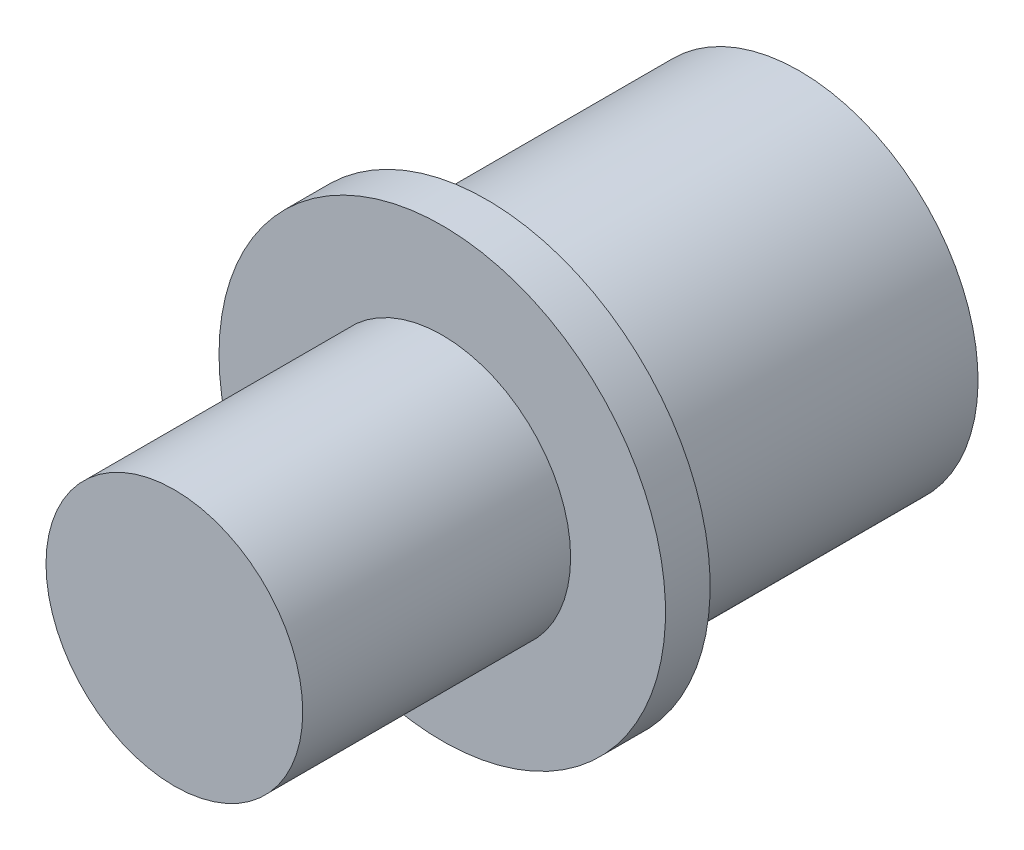
ISO-10303-21;
HEADER;
FILE_DESCRIPTION(('STEP AP214'),'2;1');
FILE_NAME('part.step','',(''),(''),'','','');
FILE_SCHEMA(('AUTOMOTIVE_DESIGN { 1 0 10303 214 1 1 1 1 }'));
ENDSEC;
DATA;
#1=APPLICATION_CONTEXT('core data for automotive mechanical design processes');
#2=APPLICATION_PROTOCOL_DEFINITION('international standard','automotive_design',2000,#1);
#3=PRODUCT_CONTEXT('',#1,'mechanical');
#4=PRODUCT('Part','Part','',(#3));
#5=PRODUCT_RELATED_PRODUCT_CATEGORY('part','',(#4));
#6=PRODUCT_DEFINITION_FORMATION('','',#4);
#7=PRODUCT_DEFINITION_CONTEXT('part definition',#1,'design');
#8=PRODUCT_DEFINITION('design','',#6,#7);
#9=PRODUCT_DEFINITION_SHAPE('','',#8);
#10=(LENGTH_UNIT() NAMED_UNIT(*) SI_UNIT(.MILLI.,.METRE.));
#11=(NAMED_UNIT(*) PLANE_ANGLE_UNIT() SI_UNIT($,.RADIAN.));
#12=(NAMED_UNIT(*) SI_UNIT($,.STERADIAN.) SOLID_ANGLE_UNIT());
#13=UNCERTAINTY_MEASURE_WITH_UNIT(LENGTH_MEASURE(1.E-05),#10,'distance_accuracy_value','');
#14=(GEOMETRIC_REPRESENTATION_CONTEXT(3) GLOBAL_UNCERTAINTY_ASSIGNED_CONTEXT((#13)) GLOBAL_UNIT_ASSIGNED_CONTEXT((#10,
#11,#12)) REPRESENTATION_CONTEXT('',''));
#15=CARTESIAN_POINT('',(0.,0.,0.));
#16=DIRECTION('',(0.,0.,1.));
#17=DIRECTION('',(1.,0.,0.));
#18=AXIS2_PLACEMENT_3D('',#15,#16,#17);
#19=CARTESIAN_POINT('',(0.,0.,-1.));
#20=DIRECTION('',(0.,0.,1.));
#21=DIRECTION('',(1.,0.,0.));
#22=AXIS2_PLACEMENT_3D('',#19,#20,#21);
#23=CYLINDRICAL_SURFACE('',#22,5.);
#24=CARTESIAN_POINT('',(0.,0.,-1.));
#25=DIRECTION('',(0.,0.,-1.));
#26=DIRECTION('',(-1.,0.,0.));
#27=AXIS2_PLACEMENT_3D('',#24,#25,#26);
#28=CIRCLE('',#27,5.);
#29=CARTESIAN_POINT('',(-5.,0.,-1.));
#30=VERTEX_POINT('',#29);
#31=EDGE_CURVE('E51',#30,#30,#28,.T.);
#32=ORIENTED_EDGE('',*,*,#31,.F.);
#33=EDGE_LOOP('',(#32));
#34=FACE_BOUND('',#33,.T.);
#35=CARTESIAN_POINT('',(0.,0.,0.));
#36=DIRECTION('',(0.,0.,-1.));
#37=DIRECTION('',(-1.,0.,0.));
#38=AXIS2_PLACEMENT_3D('',#35,#36,#37);
#39=CIRCLE('',#38,5.);
#40=CARTESIAN_POINT('',(-5.,0.,0.));
#41=VERTEX_POINT('',#40);
#42=EDGE_CURVE('E40',#41,#41,#39,.T.);
#43=ORIENTED_EDGE('',*,*,#42,.T.);
#44=EDGE_LOOP('',(#43));
#45=FACE_BOUND('',#44,.T.);
#46=ADVANCED_FACE('F37',(#34,#45),#23,.T.);
#47=CARTESIAN_POINT('',(0.,0.,-1.));
#48=DIRECTION('',(0.,0.,-1.));
#49=DIRECTION('',(-1.,0.,0.));
#50=AXIS2_PLACEMENT_3D('',#47,#48,#49);
#51=PLANE('',#50);
#52=CARTESIAN_POINT('',(0.,0.,-1.));
#53=DIRECTION('',(0.,0.,-1.));
#54=DIRECTION('',(0.,1.,0.));
#55=AXIS2_PLACEMENT_3D('',#52,#53,#54);
#56=CIRCLE('',#55,4.);
#57=CARTESIAN_POINT('',(0.,4.,-1.));
#58=VERTEX_POINT('',#57);
#59=EDGE_CURVE('E45',#58,#58,#56,.T.);
#60=ORIENTED_EDGE('',*,*,#59,.F.);
#61=EDGE_LOOP('',(#60));
#62=FACE_BOUND('',#61,.T.);
#63=ORIENTED_EDGE('',*,*,#31,.T.);
#64=EDGE_LOOP('',(#63));
#65=FACE_BOUND('',#64,.T.);
#66=ADVANCED_FACE('F79',(#62,#65),#51,.T.);
#67=CARTESIAN_POINT('',(0.,0.,0.));
#68=DIRECTION('',(0.,0.,-1.));
#69=DIRECTION('',(-1.,0.,0.));
#70=AXIS2_PLACEMENT_3D('',#67,#68,#69);
#71=PLANE('',#70);
#72=CARTESIAN_POINT('',(0.,0.,0.));
#73=DIRECTION('',(0.,0.,1.));
#74=DIRECTION('',(1.,0.,0.));
#75=AXIS2_PLACEMENT_3D('',#72,#73,#74);
#76=CIRCLE('',#75,2.875);
#77=CARTESIAN_POINT('',(2.875,0.,0.));
#78=VERTEX_POINT('',#77);
#79=EDGE_CURVE('E10',#78,#78,#76,.T.);
#80=ORIENTED_EDGE('',*,*,#79,.F.);
#81=EDGE_LOOP('',(#80));
#82=FACE_BOUND('',#81,.T.);
#83=ORIENTED_EDGE('',*,*,#42,.F.);
#84=EDGE_LOOP('',(#83));
#85=FACE_BOUND('',#84,.T.);
#86=ADVANCED_FACE('F76',(#82,#85),#71,.F.);
#87=CARTESIAN_POINT('',(0.,0.,-8.));
#88=DIRECTION('',(0.,0.,1.));
#89=DIRECTION('',(0.,-1.,0.));
#90=AXIS2_PLACEMENT_3D('',#87,#88,#89);
#91=CYLINDRICAL_SURFACE('',#90,4.);
#92=CARTESIAN_POINT('',(0.,0.,-8.));
#93=DIRECTION('',(0.,0.,-1.));
#94=DIRECTION('',(0.,1.,0.));
#95=AXIS2_PLACEMENT_3D('',#92,#93,#94);
#96=CIRCLE('',#95,4.);
#97=CARTESIAN_POINT('',(0.,4.,-8.));
#98=VERTEX_POINT('',#97);
#99=EDGE_CURVE('E60',#98,#98,#96,.T.);
#100=ORIENTED_EDGE('',*,*,#99,.F.);
#101=EDGE_LOOP('',(#100));
#102=FACE_BOUND('',#101,.T.);
#103=ORIENTED_EDGE('',*,*,#59,.T.);
#104=EDGE_LOOP('',(#103));
#105=FACE_BOUND('',#104,.T.);
#106=ADVANCED_FACE('F78',(#102,#105),#91,.T.);
#107=CARTESIAN_POINT('',(0.,0.,-8.));
#108=DIRECTION('',(0.,0.,-1.));
#109=DIRECTION('',(0.,1.,0.));
#110=AXIS2_PLACEMENT_3D('',#107,#108,#109);
#111=PLANE('',#110);
#112=CARTESIAN_POINT('',(0.,0.,-8.));
#113=DIRECTION('',(0.,0.,-1.));
#114=DIRECTION('',(0.,1.,0.));
#115=AXIS2_PLACEMENT_3D('',#112,#113,#114);
#116=CIRCLE('',#115,2.5);
#117=CARTESIAN_POINT('',(0.,2.5,-8.));
#118=VERTEX_POINT('',#117);
#119=EDGE_CURVE('E61',#118,#118,#116,.T.);
#120=ORIENTED_EDGE('',*,*,#119,.F.);
#121=EDGE_LOOP('',(#120));
#122=FACE_BOUND('',#121,.T.);
#123=ORIENTED_EDGE('',*,*,#99,.T.);
#124=EDGE_LOOP('',(#123));
#125=FACE_BOUND('',#124,.T.);
#126=ADVANCED_FACE('F85',(#122,#125),#111,.T.);
#127=CARTESIAN_POINT('',(0.,0.,-5.));
#128=DIRECTION('',(0.,0.,-1.));
#129=DIRECTION('',(0.,1.,0.));
#130=AXIS2_PLACEMENT_3D('',#127,#128,#129);
#131=CYLINDRICAL_SURFACE('',#130,2.5);
#132=CARTESIAN_POINT('',(0.,0.,-5.));
#133=DIRECTION('',(0.,0.,-1.));
#134=DIRECTION('',(0.,1.,0.));
#135=AXIS2_PLACEMENT_3D('',#132,#133,#134);
#136=CIRCLE('',#135,2.5);
#137=CARTESIAN_POINT('',(0.,2.5,-5.));
#138=VERTEX_POINT('',#137);
#139=EDGE_CURVE('E56',#138,#138,#136,.T.);
#140=ORIENTED_EDGE('',*,*,#139,.F.);
#141=EDGE_LOOP('',(#140));
#142=FACE_BOUND('',#141,.T.);
#143=ORIENTED_EDGE('',*,*,#119,.T.);
#144=EDGE_LOOP('',(#143));
#145=FACE_BOUND('',#144,.T.);
#146=ADVANCED_FACE('F114',(#142,#145),#131,.F.);
#147=CARTESIAN_POINT('',(0.,0.,-5.));
#148=DIRECTION('',(0.,0.,-1.));
#149=DIRECTION('',(0.,1.,0.));
#150=AXIS2_PLACEMENT_3D('',#147,#148,#149);
#151=PLANE('',#150);
#152=ORIENTED_EDGE('',*,*,#139,.T.);
#153=EDGE_LOOP('',(#152));
#154=FACE_BOUND('',#153,.T.);
#155=ADVANCED_FACE('F124',(#154),#151,.T.);
#156=CARTESIAN_POINT('',(0.,0.,6.));
#157=DIRECTION('',(0.,0.,-1.));
#158=DIRECTION('',(-1.,0.,0.));
#159=AXIS2_PLACEMENT_3D('',#156,#157,#158);
#160=CYLINDRICAL_SURFACE('',#159,2.875);
#161=CARTESIAN_POINT('',(0.,0.,6.));
#162=DIRECTION('',(0.,0.,1.));
#163=DIRECTION('',(1.,0.,0.));
#164=AXIS2_PLACEMENT_3D('',#161,#162,#163);
#165=CIRCLE('',#164,2.875);
#166=CARTESIAN_POINT('',(2.875,0.,6.));
#167=VERTEX_POINT('',#166);
#168=EDGE_CURVE('E55',#167,#167,#165,.T.);
#169=ORIENTED_EDGE('',*,*,#168,.F.);
#170=EDGE_LOOP('',(#169));
#171=FACE_BOUND('',#170,.T.);
#172=ORIENTED_EDGE('',*,*,#79,.T.);
#173=EDGE_LOOP('',(#172));
#174=FACE_BOUND('',#173,.T.);
#175=ADVANCED_FACE('F133',(#171,#174),#160,.T.);
#176=CARTESIAN_POINT('',(0.,0.,6.));
#177=DIRECTION('',(0.,0.,1.));
#178=DIRECTION('',(1.,0.,0.));
#179=AXIS2_PLACEMENT_3D('',#176,#177,#178);
#180=PLANE('',#179);
#181=ORIENTED_EDGE('',*,*,#168,.T.);
#182=EDGE_LOOP('',(#181));
#183=FACE_BOUND('',#182,.T.);
#184=ADVANCED_FACE('F147',(#183),#180,.T.);
#185=CLOSED_SHELL('',(#46,#66,#86,#106,#126,#146,#155,#175,#184));
#186=MANIFOLD_SOLID_BREP('B2',#185);
#187=ADVANCED_BREP_SHAPE_REPRESENTATION('',(#18,#186),#14);
#188=SHAPE_DEFINITION_REPRESENTATION(#9,#187);
ENDSEC;
END-ISO-10303-21;
